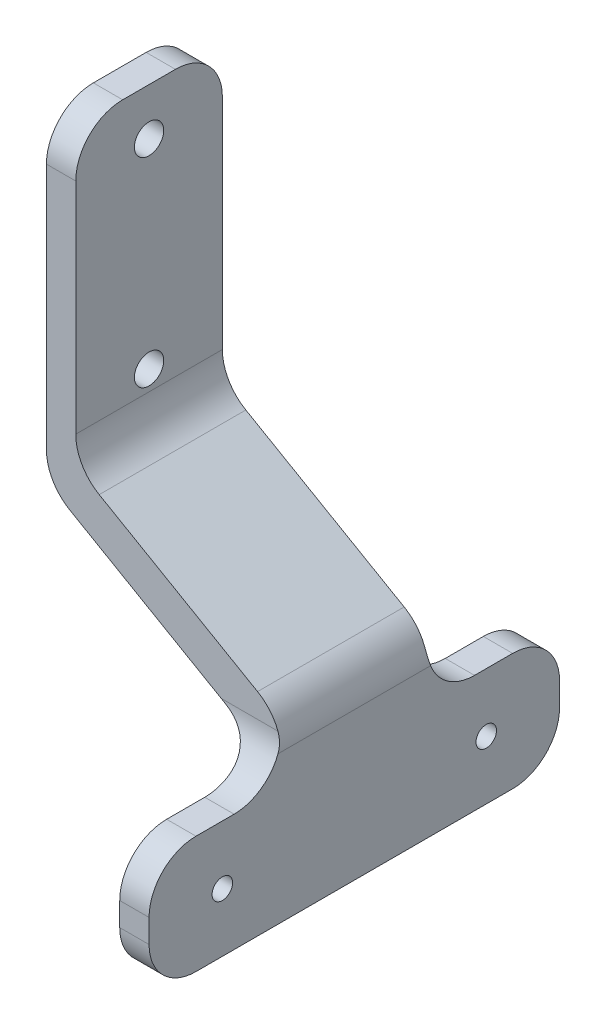
ISO-10303-21;
HEADER;
FILE_DESCRIPTION(('STEP AP214'),'2;1');
FILE_NAME('part.step','',(''),(''),'','','');
FILE_SCHEMA(('AUTOMOTIVE_DESIGN { 1 0 10303 214 1 1 1 1 }'));
ENDSEC;
DATA;
#1=APPLICATION_CONTEXT('core data for automotive mechanical design processes');
#2=APPLICATION_PROTOCOL_DEFINITION('international standard','automotive_design',2000,#1);
#3=PRODUCT_CONTEXT('',#1,'mechanical');
#4=PRODUCT('Part','Part','',(#3));
#5=PRODUCT_RELATED_PRODUCT_CATEGORY('part','',(#4));
#6=PRODUCT_DEFINITION_FORMATION('','',#4);
#7=PRODUCT_DEFINITION_CONTEXT('part definition',#1,'design');
#8=PRODUCT_DEFINITION('design','',#6,#7);
#9=PRODUCT_DEFINITION_SHAPE('','',#8);
#10=(LENGTH_UNIT() NAMED_UNIT(*) SI_UNIT(.MILLI.,.METRE.));
#11=(NAMED_UNIT(*) PLANE_ANGLE_UNIT() SI_UNIT($,.RADIAN.));
#12=(NAMED_UNIT(*) SI_UNIT($,.STERADIAN.) SOLID_ANGLE_UNIT());
#13=UNCERTAINTY_MEASURE_WITH_UNIT(LENGTH_MEASURE(1.E-05),#10,'distance_accuracy_value','');
#14=(GEOMETRIC_REPRESENTATION_CONTEXT(3) GLOBAL_UNCERTAINTY_ASSIGNED_CONTEXT((#13)) GLOBAL_UNIT_ASSIGNED_CONTEXT((#10,
#11,#12)) REPRESENTATION_CONTEXT('',''));
#15=CARTESIAN_POINT('',(0.,0.,0.));
#16=DIRECTION('',(0.,0.,1.));
#17=DIRECTION('',(1.,0.,0.));
#18=AXIS2_PLACEMENT_3D('',#15,#16,#17);
#19=CARTESIAN_POINT('',(0.,0.,12.5));
#20=DIRECTION('',(0.,0.,-1.));
#21=DIRECTION('',(-1.,0.,0.));
#22=AXIS2_PLACEMENT_3D('',#19,#20,#21);
#23=PLANE('',#22);
#24=DIRECTION('',(0.866025403784438,-0.500000000000001,0.));
#25=VECTOR('',#24,1.);
#26=CARTESIAN_POINT('',(-5.,20.2072594216369,12.5));
#27=LINE('',#26,#25);
#28=CARTESIAN_POINT('',(-1.,17.8978583448784,12.5));
#29=VERTEX_POINT('',#28);
#30=CARTESIAN_POINT('',(24.8038475772934,3.,12.5));
#31=VERTEX_POINT('',#30);
#32=EDGE_CURVE('E243',#29,#31,#27,.T.);
#33=ORIENTED_EDGE('',*,*,#32,.T.);
#34=DIRECTION('',(-1.,0.,0.));
#35=VECTOR('',#34,1.);
#36=CARTESIAN_POINT('',(0.,3.,12.5));
#37=LINE('',#36,#35);
#38=CARTESIAN_POINT('',(34.4842084400048,3.,12.5));
#39=VERTEX_POINT('',#38);
#40=EDGE_CURVE('E334',#31,#39,#37,.F.);
#41=ORIENTED_EDGE('',*,*,#40,.T.);
#42=CARTESIAN_POINT('',(27.,0.173938424846074,12.5));
#43=DIRECTION('',(0.,0.,-1.));
#44=DIRECTION('',(-1.,0.,0.));
#45=AXIS2_PLACEMENT_3D('',#42,#43,#44);
#46=CIRCLE('',#45,8.);
#47=CARTESIAN_POINT('',(31.,7.10214165512158,12.5));
#48=VERTEX_POINT('',#47);
#49=EDGE_CURVE('E289',#39,#48,#46,.F.);
#50=ORIENTED_EDGE('',*,*,#49,.T.);
#51=DIRECTION('',(-0.866025403784438,0.500000000000001,0.));
#52=VECTOR('',#51,1.);
#53=CARTESIAN_POINT('',(35.,4.79274057836308,12.5));
#54=LINE('',#53,#52);
#55=CARTESIAN_POINT('',(3.99999999999999,22.6905989232415,12.5));
#56=VERTEX_POINT('',#55);
#57=EDGE_CURVE('E240',#48,#56,#54,.T.);
#58=ORIENTED_EDGE('',*,*,#57,.T.);
#59=CARTESIAN_POINT('',(8.,29.618802153517,12.5));
#60=DIRECTION('',(0.,0.,-1.));
#61=DIRECTION('',(-1.,0.,0.));
#62=AXIS2_PLACEMENT_3D('',#59,#60,#61);
#63=CIRCLE('',#62,8.);
#64=CARTESIAN_POINT('',(0.,29.618802153517,12.5));
#65=VERTEX_POINT('',#64);
#66=EDGE_CURVE('E324',#56,#65,#63,.T.);
#67=ORIENTED_EDGE('',*,*,#66,.T.);
#68=DIRECTION('',(0.,1.,0.));
#69=VECTOR('',#68,1.);
#70=CARTESIAN_POINT('',(0.,0.,12.5));
#71=LINE('',#70,#69);
#72=CARTESIAN_POINT('',(0.,67.,12.5));
#73=VERTEX_POINT('',#72);
#74=EDGE_CURVE('E429',#65,#73,#71,.T.);
#75=ORIENTED_EDGE('',*,*,#74,.T.);
#76=DIRECTION('',(1.,0.,0.));
#77=VECTOR('',#76,1.);
#78=CARTESIAN_POINT('',(-5.,67.,12.5));
#79=LINE('',#78,#77);
#80=CARTESIAN_POINT('',(-5.,67.,12.5));
#81=VERTEX_POINT('',#80);
#82=EDGE_CURVE('E285',#73,#81,#79,.F.);
#83=ORIENTED_EDGE('',*,*,#82,.T.);
#84=DIRECTION('',(0.,1.,0.));
#85=VECTOR('',#84,1.);
#86=CARTESIAN_POINT('',(-5.,0.,12.5));
#87=LINE('',#86,#85);
#88=CARTESIAN_POINT('',(-5.,24.8260615751539,12.5));
#89=VERTEX_POINT('',#88);
#90=EDGE_CURVE('E407',#89,#81,#87,.T.);
#91=ORIENTED_EDGE('',*,*,#90,.F.);
#92=CARTESIAN_POINT('',(3.,24.8260615751539,12.5));
#93=DIRECTION('',(0.,0.,-1.));
#94=DIRECTION('',(-1.,0.,0.));
#95=AXIS2_PLACEMENT_3D('',#92,#93,#94);
#96=CIRCLE('',#95,8.);
#97=EDGE_CURVE('E287',#89,#29,#96,.F.);
#98=ORIENTED_EDGE('',*,*,#97,.T.);
#99=EDGE_LOOP('',(#33,#41,#50,#58,#67,#75,#83,#91,#98));
#100=FACE_BOUND('',#99,.T.);
#101=ADVANCED_FACE('F42',(#100),#23,.F.);
#102=CARTESIAN_POINT('',(0.,0.,-12.5));
#103=DIRECTION('',(0.,0.,-1.));
#104=DIRECTION('',(-1.,0.,0.));
#105=AXIS2_PLACEMENT_3D('',#102,#103,#104);
#106=PLANE('',#105);
#107=CARTESIAN_POINT('',(27.,0.173938424846074,-12.5));
#108=DIRECTION('',(0.,0.,-1.));
#109=DIRECTION('',(-1.,0.,0.));
#110=AXIS2_PLACEMENT_3D('',#107,#108,#109);
#111=CIRCLE('',#110,8.);
#112=CARTESIAN_POINT('',(31.,7.10214165512158,-12.5));
#113=VERTEX_POINT('',#112);
#114=CARTESIAN_POINT('',(34.4842084400048,3.,-12.5));
#115=VERTEX_POINT('',#114);
#116=EDGE_CURVE('E300',#113,#115,#111,.T.);
#117=ORIENTED_EDGE('',*,*,#116,.T.);
#118=DIRECTION('',(-1.,0.,0.));
#119=VECTOR('',#118,1.);
#120=CARTESIAN_POINT('',(30.,3.,-12.5));
#121=LINE('',#120,#119);
#122=CARTESIAN_POINT('',(24.8038475772934,3.,-12.5));
#123=VERTEX_POINT('',#122);
#124=EDGE_CURVE('E326',#115,#123,#121,.T.);
#125=ORIENTED_EDGE('',*,*,#124,.T.);
#126=DIRECTION('',(-0.866025403784438,0.500000000000001,0.));
#127=VECTOR('',#126,1.);
#128=CARTESIAN_POINT('',(7.50000000000001,12.9903810567666,-12.5));
#129=LINE('',#128,#127);
#130=CARTESIAN_POINT('',(-1.,17.8978583448784,-12.5));
#131=VERTEX_POINT('',#130);
#132=EDGE_CURVE('E250',#123,#131,#129,.T.);
#133=ORIENTED_EDGE('',*,*,#132,.T.);
#134=CARTESIAN_POINT('',(3.,24.8260615751539,-12.5));
#135=DIRECTION('',(0.,0.,-1.));
#136=DIRECTION('',(-1.,0.,0.));
#137=AXIS2_PLACEMENT_3D('',#134,#135,#136);
#138=CIRCLE('',#137,8.);
#139=CARTESIAN_POINT('',(-5.,24.8260615751539,-12.5));
#140=VERTEX_POINT('',#139);
#141=EDGE_CURVE('E298',#131,#140,#138,.T.);
#142=ORIENTED_EDGE('',*,*,#141,.T.);
#143=DIRECTION('',(0.,1.,0.));
#144=VECTOR('',#143,1.);
#145=CARTESIAN_POINT('',(-5.,0.,-12.5));
#146=LINE('',#145,#144);
#147=CARTESIAN_POINT('',(-5.,67.,-12.5));
#148=VERTEX_POINT('',#147);
#149=EDGE_CURVE('E416',#140,#148,#146,.T.);
#150=ORIENTED_EDGE('',*,*,#149,.T.);
#151=DIRECTION('',(1.,0.,0.));
#152=VECTOR('',#151,1.);
#153=CARTESIAN_POINT('',(0.,67.,-12.5));
#154=LINE('',#153,#152);
#155=CARTESIAN_POINT('',(0.,67.,-12.5));
#156=VERTEX_POINT('',#155);
#157=EDGE_CURVE('E295',#148,#156,#154,.T.);
#158=ORIENTED_EDGE('',*,*,#157,.T.);
#159=DIRECTION('',(0.,1.,0.));
#160=VECTOR('',#159,1.);
#161=CARTESIAN_POINT('',(0.,0.,-12.5));
#162=LINE('',#161,#160);
#163=CARTESIAN_POINT('',(0.,29.618802153517,-12.5));
#164=VERTEX_POINT('',#163);
#165=EDGE_CURVE('E433',#164,#156,#162,.T.);
#166=ORIENTED_EDGE('',*,*,#165,.F.);
#167=CARTESIAN_POINT('',(8.,29.618802153517,-12.5));
#168=DIRECTION('',(0.,0.,-1.));
#169=DIRECTION('',(-1.,0.,0.));
#170=AXIS2_PLACEMENT_3D('',#167,#168,#169);
#171=CIRCLE('',#170,8.);
#172=CARTESIAN_POINT('',(3.99999999999999,22.6905989232415,-12.5));
#173=VERTEX_POINT('',#172);
#174=EDGE_CURVE('E322',#164,#173,#171,.F.);
#175=ORIENTED_EDGE('',*,*,#174,.T.);
#176=DIRECTION('',(0.866025403784438,-0.500000000000001,0.));
#177=VECTOR('',#176,1.);
#178=CARTESIAN_POINT('',(10.8253175473055,18.75,-12.5));
#179=LINE('',#178,#177);
#180=EDGE_CURVE('E247',#173,#113,#179,.T.);
#181=ORIENTED_EDGE('',*,*,#180,.T.);
#182=EDGE_LOOP('',(#117,#125,#133,#142,#150,#158,#166,#175,#181));
#183=FACE_BOUND('',#182,.T.);
#184=ADVANCED_FACE('F552',(#183),#106,.T.);
#185=CARTESIAN_POINT('',(30.,0.,0.));
#186=DIRECTION('',(1.,0.,0.));
#187=DIRECTION('',(0.,0.,-1.));
#188=AXIS2_PLACEMENT_3D('',#185,#186,#187);
#189=PLANE('',#188);
#190=CARTESIAN_POINT('',(30.,-15.,22.5));
#191=DIRECTION('',(1.,0.,0.));
#192=DIRECTION('',(0.,0.,-1.));
#193=AXIS2_PLACEMENT_3D('',#190,#191,#192);
#194=CIRCLE('',#193,1.75);
#195=CARTESIAN_POINT('',(30.,-15.,20.75));
#196=VERTEX_POINT('',#195);
#197=EDGE_CURVE('E430',#196,#196,#194,.T.);
#198=ORIENTED_EDGE('',*,*,#197,.T.);
#199=EDGE_LOOP('',(#198));
#200=FACE_BOUND('',#199,.T.);
#201=CARTESIAN_POINT('',(30.,-15.,-22.5));
#202=DIRECTION('',(1.,0.,0.));
#203=DIRECTION('',(0.,0.,-1.));
#204=AXIS2_PLACEMENT_3D('',#201,#202,#203);
#205=CIRCLE('',#204,1.75);
#206=CARTESIAN_POINT('',(30.,-15.,-24.25));
#207=VERTEX_POINT('',#206);
#208=EDGE_CURVE('E504',#207,#207,#205,.T.);
#209=ORIENTED_EDGE('',*,*,#208,.T.);
#210=EDGE_LOOP('',(#209));
#211=FACE_BOUND('',#210,.T.);
#212=DIRECTION('',(0.,0.,-1.));
#213=VECTOR('',#212,1.);
#214=CARTESIAN_POINT('',(30.,-25.,0.));
#215=LINE('',#214,#213);
#216=CARTESIAN_POINT('',(30.,-25.,27.));
#217=VERTEX_POINT('',#216);
#218=CARTESIAN_POINT('',(30.,-25.,-27.));
#219=VERTEX_POINT('',#218);
#220=EDGE_CURVE('E220',#217,#219,#215,.T.);
#221=ORIENTED_EDGE('',*,*,#220,.F.);
#222=CARTESIAN_POINT('',(30.,-17.,27.));
#223=DIRECTION('',(1.,0.,0.));
#224=DIRECTION('',(0.,0.,-1.));
#225=AXIS2_PLACEMENT_3D('',#222,#223,#224);
#226=CIRCLE('',#225,8.);
#227=CARTESIAN_POINT('',(30.,-17.,35.));
#228=VERTEX_POINT('',#227);
#229=EDGE_CURVE('E203',#217,#228,#226,.F.);
#230=ORIENTED_EDGE('',*,*,#229,.T.);
#231=DIRECTION('',(0.,1.,0.));
#232=VECTOR('',#231,1.);
#233=CARTESIAN_POINT('',(30.,0.,35.));
#234=LINE('',#233,#232);
#235=CARTESIAN_POINT('',(30.,-13.,35.));
#236=VERTEX_POINT('',#235);
#237=EDGE_CURVE('E231',#228,#236,#234,.T.);
#238=ORIENTED_EDGE('',*,*,#237,.T.);
#239=CARTESIAN_POINT('',(30.,-13.,27.));
#240=DIRECTION('',(1.,0.,0.));
#241=DIRECTION('',(0.,0.,-1.));
#242=AXIS2_PLACEMENT_3D('',#239,#240,#241);
#243=CIRCLE('',#242,8.);
#244=CARTESIAN_POINT('',(30.,-5.,27.));
#245=VERTEX_POINT('',#244);
#246=EDGE_CURVE('E214',#236,#245,#243,.F.);
#247=ORIENTED_EDGE('',*,*,#246,.T.);
#248=DIRECTION('',(0.,0.,-1.));
#249=VECTOR('',#248,1.);
#250=CARTESIAN_POINT('',(30.,-5.,0.));
#251=LINE('',#250,#249);
#252=CARTESIAN_POINT('',(30.,-5.,20.5));
#253=VERTEX_POINT('',#252);
#254=EDGE_CURVE('E236',#245,#253,#251,.T.);
#255=ORIENTED_EDGE('',*,*,#254,.T.);
#256=CARTESIAN_POINT('',(30.,3.,20.5));
#257=DIRECTION('',(1.,0.,0.));
#258=DIRECTION('',(0.,0.,-1.));
#259=AXIS2_PLACEMENT_3D('',#256,#257,#258);
#260=CIRCLE('',#259,8.);
#261=CARTESIAN_POINT('',(30.,-4.61880215351701,18.0599480035098));
#262=VERTEX_POINT('',#261);
#263=EDGE_CURVE('E367',#253,#262,#260,.T.);
#264=ORIENTED_EDGE('',*,*,#263,.T.);
#265=DIRECTION('',(0.,0.,-1.));
#266=VECTOR('',#265,1.);
#267=CARTESIAN_POINT('',(30.,-4.61880215351701,0.));
#268=LINE('',#267,#266);
#269=CARTESIAN_POINT('',(30.,-4.61880215351701,-18.0599480035098));
#270=VERTEX_POINT('',#269);
#271=EDGE_CURVE('E224',#262,#270,#268,.T.);
#272=ORIENTED_EDGE('',*,*,#271,.T.);
#273=CARTESIAN_POINT('',(30.,3.,-20.5));
#274=DIRECTION('',(1.,0.,0.));
#275=DIRECTION('',(0.,0.,-1.));
#276=AXIS2_PLACEMENT_3D('',#273,#274,#275);
#277=CIRCLE('',#276,8.);
#278=CARTESIAN_POINT('',(30.,-5.,-20.5));
#279=VERTEX_POINT('',#278);
#280=EDGE_CURVE('E346',#270,#279,#277,.T.);
#281=ORIENTED_EDGE('',*,*,#280,.T.);
#282=CARTESIAN_POINT('',(30.,-5.,-27.));
#283=VERTEX_POINT('',#282);
#284=EDGE_CURVE('E234',#279,#283,#251,.T.);
#285=ORIENTED_EDGE('',*,*,#284,.T.);
#286=CARTESIAN_POINT('',(30.,-13.,-27.));
#287=DIRECTION('',(1.,0.,0.));
#288=DIRECTION('',(0.,0.,-1.));
#289=AXIS2_PLACEMENT_3D('',#286,#287,#288);
#290=CIRCLE('',#289,8.);
#291=CARTESIAN_POINT('',(30.,-13.,-35.));
#292=VERTEX_POINT('',#291);
#293=EDGE_CURVE('E254',#283,#292,#290,.F.);
#294=ORIENTED_EDGE('',*,*,#293,.T.);
#295=DIRECTION('',(0.,1.,0.));
#296=VECTOR('',#295,1.);
#297=CARTESIAN_POINT('',(30.,0.,-35.));
#298=LINE('',#297,#296);
#299=CARTESIAN_POINT('',(30.,-17.,-35.));
#300=VERTEX_POINT('',#299);
#301=EDGE_CURVE('E230',#300,#292,#298,.T.);
#302=ORIENTED_EDGE('',*,*,#301,.F.);
#303=CARTESIAN_POINT('',(30.,-17.,-27.));
#304=DIRECTION('',(1.,0.,0.));
#305=DIRECTION('',(0.,0.,-1.));
#306=AXIS2_PLACEMENT_3D('',#303,#304,#305);
#307=CIRCLE('',#306,8.);
#308=EDGE_CURVE('E229',#300,#219,#307,.F.);
#309=ORIENTED_EDGE('',*,*,#308,.T.);
#310=EDGE_LOOP('',(#221,#230,#238,#247,#255,#264,#272,#281,#285,#294,#302,#309));
#311=FACE_BOUND('',#310,.T.);
#312=ADVANCED_FACE('F227',(#200,#211,#311),#189,.F.);
#313=CARTESIAN_POINT('',(35.,-5.,0.));
#314=DIRECTION('',(0.,1.,0.));
#315=DIRECTION('',(0.,0.,1.));
#316=AXIS2_PLACEMENT_3D('',#313,#314,#315);
#317=PLANE('',#316);
#318=DIRECTION('',(0.,0.,-1.));
#319=VECTOR('',#318,1.);
#320=CARTESIAN_POINT('',(35.,-5.,0.));
#321=LINE('',#320,#319);
#322=CARTESIAN_POINT('',(35.,-5.,27.));
#323=VERTEX_POINT('',#322);
#324=CARTESIAN_POINT('',(35.,-5.,20.5));
#325=VERTEX_POINT('',#324);
#326=EDGE_CURVE('E436',#323,#325,#321,.T.);
#327=ORIENTED_EDGE('',*,*,#326,.T.);
#328=DIRECTION('',(-1.,0.,0.));
#329=VECTOR('',#328,1.);
#330=CARTESIAN_POINT('',(35.,-5.,20.5));
#331=LINE('',#330,#329);
#332=EDGE_CURVE('E331',#325,#253,#331,.T.);
#333=ORIENTED_EDGE('',*,*,#332,.T.);
#334=ORIENTED_EDGE('',*,*,#254,.F.);
#335=DIRECTION('',(-1.,0.,0.));
#336=VECTOR('',#335,1.);
#337=CARTESIAN_POINT('',(35.,-5.,27.));
#338=LINE('',#337,#336);
#339=EDGE_CURVE('E271',#245,#323,#338,.F.);
#340=ORIENTED_EDGE('',*,*,#339,.T.);
#341=EDGE_LOOP('',(#327,#333,#334,#340));
#342=FACE_BOUND('',#341,.T.);
#343=ADVANCED_FACE('F475',(#342),#317,.T.);
#344=CARTESIAN_POINT('',(35.,0.,35.));
#345=DIRECTION('',(0.,0.,1.));
#346=DIRECTION('',(0.,-1.,0.));
#347=AXIS2_PLACEMENT_3D('',#344,#345,#346);
#348=PLANE('',#347);
#349=ORIENTED_EDGE('',*,*,#237,.F.);
#350=DIRECTION('',(-1.,0.,0.));
#351=VECTOR('',#350,1.);
#352=CARTESIAN_POINT('',(35.,-17.,35.));
#353=LINE('',#352,#351);
#354=CARTESIAN_POINT('',(35.,-17.,35.));
#355=VERTEX_POINT('',#354);
#356=EDGE_CURVE('E208',#228,#355,#353,.F.);
#357=ORIENTED_EDGE('',*,*,#356,.T.);
#358=DIRECTION('',(0.,1.,0.));
#359=VECTOR('',#358,1.);
#360=CARTESIAN_POINT('',(35.,0.,35.));
#361=LINE('',#360,#359);
#362=CARTESIAN_POINT('',(35.,-13.,35.));
#363=VERTEX_POINT('',#362);
#364=EDGE_CURVE('E439',#355,#363,#361,.T.);
#365=ORIENTED_EDGE('',*,*,#364,.T.);
#366=DIRECTION('',(-1.,0.,0.));
#367=VECTOR('',#366,1.);
#368=CARTESIAN_POINT('',(35.,-13.,35.));
#369=LINE('',#368,#367);
#370=EDGE_CURVE('E213',#363,#236,#369,.T.);
#371=ORIENTED_EDGE('',*,*,#370,.T.);
#372=EDGE_LOOP('',(#349,#357,#365,#371));
#373=FACE_BOUND('',#372,.T.);
#374=ADVANCED_FACE('F470',(#373),#348,.T.);
#375=CARTESIAN_POINT('',(35.,-25.,0.));
#376=DIRECTION('',(0.,1.,0.));
#377=DIRECTION('',(0.,0.,1.));
#378=AXIS2_PLACEMENT_3D('',#375,#376,#377);
#379=PLANE('',#378);
#380=DIRECTION('',(0.,0.,-1.));
#381=VECTOR('',#380,1.);
#382=CARTESIAN_POINT('',(35.,-25.,0.));
#383=LINE('',#382,#381);
#384=CARTESIAN_POINT('',(35.,-25.,27.));
#385=VERTEX_POINT('',#384);
#386=CARTESIAN_POINT('',(35.,-25.,-27.));
#387=VERTEX_POINT('',#386);
#388=EDGE_CURVE('E223',#385,#387,#383,.T.);
#389=ORIENTED_EDGE('',*,*,#388,.F.);
#390=DIRECTION('',(-1.,0.,0.));
#391=VECTOR('',#390,1.);
#392=CARTESIAN_POINT('',(30.,-25.,27.));
#393=LINE('',#392,#391);
#394=EDGE_CURVE('E207',#385,#217,#393,.T.);
#395=ORIENTED_EDGE('',*,*,#394,.T.);
#396=ORIENTED_EDGE('',*,*,#220,.T.);
#397=DIRECTION('',(-1.,0.,0.));
#398=VECTOR('',#397,1.);
#399=CARTESIAN_POINT('',(35.,-25.,-27.));
#400=LINE('',#399,#398);
#401=EDGE_CURVE('E225',#219,#387,#400,.F.);
#402=ORIENTED_EDGE('',*,*,#401,.T.);
#403=EDGE_LOOP('',(#389,#395,#396,#402));
#404=FACE_BOUND('',#403,.T.);
#405=ADVANCED_FACE('F219',(#404),#379,.F.);
#406=CARTESIAN_POINT('',(35.,0.,-35.));
#407=DIRECTION('',(0.,0.,1.));
#408=DIRECTION('',(1.,0.,0.));
#409=AXIS2_PLACEMENT_3D('',#406,#407,#408);
#410=PLANE('',#409);
#411=DIRECTION('',(0.,1.,0.));
#412=VECTOR('',#411,1.);
#413=CARTESIAN_POINT('',(35.,0.,-35.));
#414=LINE('',#413,#412);
#415=CARTESIAN_POINT('',(35.,-17.,-35.));
#416=VERTEX_POINT('',#415);
#417=CARTESIAN_POINT('',(35.,-13.,-35.));
#418=VERTEX_POINT('',#417);
#419=EDGE_CURVE('E443',#416,#418,#414,.T.);
#420=ORIENTED_EDGE('',*,*,#419,.F.);
#421=DIRECTION('',(-1.,0.,0.));
#422=VECTOR('',#421,1.);
#423=CARTESIAN_POINT('',(35.,-17.,-35.));
#424=LINE('',#423,#422);
#425=EDGE_CURVE('E275',#416,#300,#424,.T.);
#426=ORIENTED_EDGE('',*,*,#425,.T.);
#427=ORIENTED_EDGE('',*,*,#301,.T.);
#428=DIRECTION('',(-1.,0.,0.));
#429=VECTOR('',#428,1.);
#430=CARTESIAN_POINT('',(35.,-13.,-35.));
#431=LINE('',#430,#429);
#432=EDGE_CURVE('E273',#292,#418,#431,.F.);
#433=ORIENTED_EDGE('',*,*,#432,.T.);
#434=EDGE_LOOP('',(#420,#426,#427,#433));
#435=FACE_BOUND('',#434,.T.);
#436=ADVANCED_FACE('F461',(#435),#410,.F.);
#437=ORIENTED_EDGE('',*,*,#284,.F.);
#438=DIRECTION('',(-1.,0.,0.));
#439=VECTOR('',#438,1.);
#440=CARTESIAN_POINT('',(35.,-5.,-20.5));
#441=LINE('',#440,#439);
#442=CARTESIAN_POINT('',(35.,-5.,-20.5));
#443=VERTEX_POINT('',#442);
#444=EDGE_CURVE('E329',#279,#443,#441,.F.);
#445=ORIENTED_EDGE('',*,*,#444,.T.);
#446=CARTESIAN_POINT('',(35.,-5.,-27.));
#447=VERTEX_POINT('',#446);
#448=EDGE_CURVE('E244',#443,#447,#321,.T.);
#449=ORIENTED_EDGE('',*,*,#448,.T.);
#450=DIRECTION('',(-1.,0.,0.));
#451=VECTOR('',#450,1.);
#452=CARTESIAN_POINT('',(30.,-5.,-27.));
#453=LINE('',#452,#451);
#454=EDGE_CURVE('E278',#447,#283,#453,.T.);
#455=ORIENTED_EDGE('',*,*,#454,.T.);
#456=EDGE_LOOP('',(#437,#445,#449,#455));
#457=FACE_BOUND('',#456,.T.);
#458=ADVANCED_FACE('F450',(#457),#317,.T.);
#459=CARTESIAN_POINT('',(35.,0.,0.));
#460=DIRECTION('',(1.,0.,0.));
#461=DIRECTION('',(0.,0.,-1.));
#462=AXIS2_PLACEMENT_3D('',#459,#460,#461);
#463=PLANE('',#462);
#464=CARTESIAN_POINT('',(35.,-15.,22.5));
#465=DIRECTION('',(1.,0.,0.));
#466=DIRECTION('',(0.,0.,-1.));
#467=AXIS2_PLACEMENT_3D('',#464,#465,#466);
#468=CIRCLE('',#467,1.75);
#469=CARTESIAN_POINT('',(35.,-15.,20.75));
#470=VERTEX_POINT('',#469);
#471=EDGE_CURVE('E507',#470,#470,#468,.T.);
#472=ORIENTED_EDGE('',*,*,#471,.F.);
#473=EDGE_LOOP('',(#472));
#474=FACE_BOUND('',#473,.T.);
#475=CARTESIAN_POINT('',(35.,-15.,-22.5));
#476=DIRECTION('',(1.,0.,0.));
#477=DIRECTION('',(0.,0.,-1.));
#478=AXIS2_PLACEMENT_3D('',#475,#476,#477);
#479=CIRCLE('',#478,1.75);
#480=CARTESIAN_POINT('',(35.,-15.,-24.25));
#481=VERTEX_POINT('',#480);
#482=EDGE_CURVE('E508',#481,#481,#479,.T.);
#483=ORIENTED_EDGE('',*,*,#482,.F.);
#484=EDGE_LOOP('',(#483));
#485=FACE_BOUND('',#484,.T.);
#486=ORIENTED_EDGE('',*,*,#364,.F.);
#487=CARTESIAN_POINT('',(35.,-17.,27.));
#488=DIRECTION('',(1.,0.,0.));
#489=DIRECTION('',(0.,0.,-1.));
#490=AXIS2_PLACEMENT_3D('',#487,#488,#489);
#491=CIRCLE('',#490,8.);
#492=EDGE_CURVE('E269',#355,#385,#491,.T.);
#493=ORIENTED_EDGE('',*,*,#492,.T.);
#494=ORIENTED_EDGE('',*,*,#388,.T.);
#495=CARTESIAN_POINT('',(35.,-17.,-27.));
#496=DIRECTION('',(1.,0.,0.));
#497=DIRECTION('',(0.,0.,-1.));
#498=AXIS2_PLACEMENT_3D('',#495,#496,#497);
#499=CIRCLE('',#498,8.);
#500=EDGE_CURVE('E265',#387,#416,#499,.T.);
#501=ORIENTED_EDGE('',*,*,#500,.T.);
#502=ORIENTED_EDGE('',*,*,#419,.T.);
#503=CARTESIAN_POINT('',(35.,-13.,-27.));
#504=DIRECTION('',(1.,0.,0.));
#505=DIRECTION('',(0.,0.,-1.));
#506=AXIS2_PLACEMENT_3D('',#503,#504,#505);
#507=CIRCLE('',#506,8.);
#508=EDGE_CURVE('E262',#418,#447,#507,.T.);
#509=ORIENTED_EDGE('',*,*,#508,.T.);
#510=ORIENTED_EDGE('',*,*,#448,.F.);
#511=CARTESIAN_POINT('',(35.,3.,-20.5));
#512=DIRECTION('',(1.,0.,0.));
#513=DIRECTION('',(0.,0.,-1.));
#514=AXIS2_PLACEMENT_3D('',#511,#512,#513);
#515=CIRCLE('',#514,8.);
#516=CARTESIAN_POINT('',(35.,0.173938424846074,-13.0157915599952));
#517=VERTEX_POINT('',#516);
#518=EDGE_CURVE('E368',#443,#517,#515,.F.);
#519=ORIENTED_EDGE('',*,*,#518,.T.);
#520=DIRECTION('',(0.,0.,1.));
#521=VECTOR('',#520,1.);
#522=CARTESIAN_POINT('',(35.,0.173938424846074,0.));
#523=LINE('',#522,#521);
#524=CARTESIAN_POINT('',(35.,0.173938424846074,13.0157915599952));
#525=VERTEX_POINT('',#524);
#526=EDGE_CURVE('E57',#517,#525,#523,.T.);
#527=ORIENTED_EDGE('',*,*,#526,.T.);
#528=CARTESIAN_POINT('',(35.,3.,20.5));
#529=DIRECTION('',(1.,0.,0.));
#530=DIRECTION('',(0.,0.,-1.));
#531=AXIS2_PLACEMENT_3D('',#528,#529,#530);
#532=CIRCLE('',#531,8.);
#533=EDGE_CURVE('E11',#525,#325,#532,.F.);
#534=ORIENTED_EDGE('',*,*,#533,.T.);
#535=ORIENTED_EDGE('',*,*,#326,.F.);
#536=CARTESIAN_POINT('',(35.,-13.,27.));
#537=DIRECTION('',(1.,0.,0.));
#538=DIRECTION('',(0.,0.,-1.));
#539=AXIS2_PLACEMENT_3D('',#536,#537,#538);
#540=CIRCLE('',#539,8.);
#541=EDGE_CURVE('E267',#323,#363,#540,.T.);
#542=ORIENTED_EDGE('',*,*,#541,.T.);
#543=EDGE_LOOP('',(#486,#493,#494,#501,#502,#509,#510,#519,#527,#534,#535,#542));
#544=FACE_BOUND('',#543,.T.);
#545=ADVANCED_FACE('F455',(#474,#485,#544),#463,.T.);
#546=CARTESIAN_POINT('',(0.,0.,0.));
#547=DIRECTION('',(-1.,0.,0.));
#548=DIRECTION('',(0.,0.,1.));
#549=AXIS2_PLACEMENT_3D('',#546,#547,#548);
#550=PLANE('',#549);
#551=CARTESIAN_POINT('',(0.,67.,0.));
#552=DIRECTION('',(1.,0.,0.));
#553=DIRECTION('',(0.,0.,-1.));
#554=AXIS2_PLACEMENT_3D('',#551,#552,#553);
#555=CIRCLE('',#554,2.5);
#556=CARTESIAN_POINT('',(0.,67.,-2.5));
#557=VERTEX_POINT('',#556);
#558=EDGE_CURVE('E520',#557,#557,#555,.T.);
#559=ORIENTED_EDGE('',*,*,#558,.F.);
#560=EDGE_LOOP('',(#559));
#561=FACE_BOUND('',#560,.T.);
#562=CARTESIAN_POINT('',(0.,33.,0.));
#563=DIRECTION('',(1.,0.,0.));
#564=DIRECTION('',(0.,0.,-1.));
#565=AXIS2_PLACEMENT_3D('',#562,#563,#564);
#566=CIRCLE('',#565,2.5);
#567=CARTESIAN_POINT('',(0.,33.,-2.5));
#568=VERTEX_POINT('',#567);
#569=EDGE_CURVE('E514',#568,#568,#566,.T.);
#570=ORIENTED_EDGE('',*,*,#569,.F.);
#571=EDGE_LOOP('',(#570));
#572=FACE_BOUND('',#571,.T.);
#573=ORIENTED_EDGE('',*,*,#74,.F.);
#574=DIRECTION('',(0.,0.,-1.));
#575=VECTOR('',#574,1.);
#576=CARTESIAN_POINT('',(0.,29.618802153517,0.));
#577=LINE('',#576,#575);
#578=EDGE_CURVE('E314',#65,#164,#577,.T.);
#579=ORIENTED_EDGE('',*,*,#578,.T.);
#580=ORIENTED_EDGE('',*,*,#165,.T.);
#581=CARTESIAN_POINT('',(0.,67.,-4.5));
#582=DIRECTION('',(-1.,0.,0.));
#583=DIRECTION('',(0.,0.,1.));
#584=AXIS2_PLACEMENT_3D('',#581,#582,#583);
#585=CIRCLE('',#584,8.);
#586=CARTESIAN_POINT('',(0.,75.,-4.5));
#587=VERTEX_POINT('',#586);
#588=EDGE_CURVE('E310',#156,#587,#585,.F.);
#589=ORIENTED_EDGE('',*,*,#588,.T.);
#590=DIRECTION('',(0.,0.,1.));
#591=VECTOR('',#590,1.);
#592=CARTESIAN_POINT('',(0.,75.,-12.5));
#593=LINE('',#592,#591);
#594=CARTESIAN_POINT('',(0.,75.,4.5));
#595=VERTEX_POINT('',#594);
#596=EDGE_CURVE('E426',#587,#595,#593,.T.);
#597=ORIENTED_EDGE('',*,*,#596,.T.);
#598=CARTESIAN_POINT('',(0.,67.,4.5));
#599=DIRECTION('',(-1.,0.,0.));
#600=DIRECTION('',(0.,0.,1.));
#601=AXIS2_PLACEMENT_3D('',#598,#599,#600);
#602=CIRCLE('',#601,8.);
#603=EDGE_CURVE('E312',#595,#73,#602,.F.);
#604=ORIENTED_EDGE('',*,*,#603,.T.);
#605=EDGE_LOOP('',(#573,#579,#580,#589,#597,#604));
#606=FACE_BOUND('',#605,.T.);
#607=ADVANCED_FACE('F491',(#561,#572,#606),#550,.F.);
#608=CARTESIAN_POINT('',(-5.,75.,-12.5));
#609=DIRECTION('',(0.,1.,0.));
#610=DIRECTION('',(0.,0.,1.));
#611=AXIS2_PLACEMENT_3D('',#608,#609,#610);
#612=PLANE('',#611);
#613=DIRECTION('',(0.,0.,1.));
#614=VECTOR('',#613,1.);
#615=CARTESIAN_POINT('',(-5.,75.,-12.5));
#616=LINE('',#615,#614);
#617=CARTESIAN_POINT('',(-5.,75.,-4.5));
#618=VERTEX_POINT('',#617);
#619=CARTESIAN_POINT('',(-5.,75.,4.5));
#620=VERTEX_POINT('',#619);
#621=EDGE_CURVE('E422',#618,#620,#616,.T.);
#622=ORIENTED_EDGE('',*,*,#621,.T.);
#623=DIRECTION('',(1.,0.,0.));
#624=VECTOR('',#623,1.);
#625=CARTESIAN_POINT('',(0.,75.,4.5));
#626=LINE('',#625,#624);
#627=EDGE_CURVE('E319',#620,#595,#626,.T.);
#628=ORIENTED_EDGE('',*,*,#627,.T.);
#629=ORIENTED_EDGE('',*,*,#596,.F.);
#630=DIRECTION('',(1.,0.,0.));
#631=VECTOR('',#630,1.);
#632=CARTESIAN_POINT('',(-5.,75.,-4.5));
#633=LINE('',#632,#631);
#634=EDGE_CURVE('E317',#587,#618,#633,.F.);
#635=ORIENTED_EDGE('',*,*,#634,.T.);
#636=EDGE_LOOP('',(#622,#628,#629,#635));
#637=FACE_BOUND('',#636,.T.);
#638=ADVANCED_FACE('F499',(#637),#612,.T.);
#639=CARTESIAN_POINT('',(-5.,0.,0.));
#640=DIRECTION('',(-1.,0.,0.));
#641=DIRECTION('',(0.,0.,1.));
#642=AXIS2_PLACEMENT_3D('',#639,#640,#641);
#643=PLANE('',#642);
#644=CARTESIAN_POINT('',(-5.,67.,0.));
#645=DIRECTION('',(1.,0.,0.));
#646=DIRECTION('',(0.,0.,-1.));
#647=AXIS2_PLACEMENT_3D('',#644,#645,#646);
#648=CIRCLE('',#647,2.5);
#649=CARTESIAN_POINT('',(-5.,67.,-2.5));
#650=VERTEX_POINT('',#649);
#651=EDGE_CURVE('E511',#650,#650,#648,.T.);
#652=ORIENTED_EDGE('',*,*,#651,.T.);
#653=EDGE_LOOP('',(#652));
#654=FACE_BOUND('',#653,.T.);
#655=CARTESIAN_POINT('',(-5.,33.,0.));
#656=DIRECTION('',(1.,0.,0.));
#657=DIRECTION('',(0.,0.,-1.));
#658=AXIS2_PLACEMENT_3D('',#655,#656,#657);
#659=CIRCLE('',#658,2.5);
#660=CARTESIAN_POINT('',(-5.,33.,-2.5));
#661=VERTEX_POINT('',#660);
#662=EDGE_CURVE('E517',#661,#661,#659,.T.);
#663=ORIENTED_EDGE('',*,*,#662,.T.);
#664=EDGE_LOOP('',(#663));
#665=FACE_BOUND('',#664,.T.);
#666=ORIENTED_EDGE('',*,*,#149,.F.);
#667=DIRECTION('',(0.,0.,1.));
#668=VECTOR('',#667,1.);
#669=CARTESIAN_POINT('',(-5.,24.8260615751539,0.));
#670=LINE('',#669,#668);
#671=EDGE_CURVE('E307',#140,#89,#670,.T.);
#672=ORIENTED_EDGE('',*,*,#671,.T.);
#673=ORIENTED_EDGE('',*,*,#90,.T.);
#674=CARTESIAN_POINT('',(-5.,67.,4.5));
#675=DIRECTION('',(-1.,0.,0.));
#676=DIRECTION('',(0.,0.,1.));
#677=AXIS2_PLACEMENT_3D('',#674,#675,#676);
#678=CIRCLE('',#677,8.);
#679=EDGE_CURVE('E305',#81,#620,#678,.T.);
#680=ORIENTED_EDGE('',*,*,#679,.T.);
#681=ORIENTED_EDGE('',*,*,#621,.F.);
#682=CARTESIAN_POINT('',(-5.,67.,-4.5));
#683=DIRECTION('',(-1.,0.,0.));
#684=DIRECTION('',(0.,0.,1.));
#685=AXIS2_PLACEMENT_3D('',#682,#683,#684);
#686=CIRCLE('',#685,8.);
#687=EDGE_CURVE('E303',#618,#148,#686,.T.);
#688=ORIENTED_EDGE('',*,*,#687,.T.);
#689=EDGE_LOOP('',(#666,#672,#673,#680,#681,#688));
#690=FACE_BOUND('',#689,.T.);
#691=ADVANCED_FACE('F413',(#654,#665,#690),#643,.T.);
#692=CARTESIAN_POINT('',(-5.,-15.,-22.5));
#693=DIRECTION('',(1.,0.,0.));
#694=DIRECTION('',(0.,0.,-1.));
#695=AXIS2_PLACEMENT_3D('',#692,#693,#694);
#696=CYLINDRICAL_SURFACE('',#695,1.75);
#697=ORIENTED_EDGE('',*,*,#482,.T.);
#698=EDGE_LOOP('',(#697));
#699=FACE_BOUND('',#698,.T.);
#700=ORIENTED_EDGE('',*,*,#208,.F.);
#701=EDGE_LOOP('',(#700));
#702=FACE_BOUND('',#701,.T.);
#703=ADVANCED_FACE('F547',(#699,#702),#696,.F.);
#704=CARTESIAN_POINT('',(-5.,-15.,22.5));
#705=DIRECTION('',(1.,0.,0.));
#706=DIRECTION('',(0.,0.,-1.));
#707=AXIS2_PLACEMENT_3D('',#704,#705,#706);
#708=CYLINDRICAL_SURFACE('',#707,1.75);
#709=ORIENTED_EDGE('',*,*,#471,.T.);
#710=EDGE_LOOP('',(#709));
#711=FACE_BOUND('',#710,.T.);
#712=ORIENTED_EDGE('',*,*,#197,.F.);
#713=EDGE_LOOP('',(#712));
#714=FACE_BOUND('',#713,.T.);
#715=ADVANCED_FACE('F541',(#711,#714),#708,.F.);
#716=CARTESIAN_POINT('',(-5.,33.,0.));
#717=DIRECTION('',(1.,0.,0.));
#718=DIRECTION('',(0.,0.,-1.));
#719=AXIS2_PLACEMENT_3D('',#716,#717,#718);
#720=CYLINDRICAL_SURFACE('',#719,2.5);
#721=ORIENTED_EDGE('',*,*,#662,.F.);
#722=EDGE_LOOP('',(#721));
#723=FACE_BOUND('',#722,.T.);
#724=ORIENTED_EDGE('',*,*,#569,.T.);
#725=EDGE_LOOP('',(#724));
#726=FACE_BOUND('',#725,.T.);
#727=ADVANCED_FACE('F531',(#723,#726),#720,.F.);
#728=CARTESIAN_POINT('',(-5.,67.,0.));
#729=DIRECTION('',(1.,0.,0.));
#730=DIRECTION('',(0.,0.,-1.));
#731=AXIS2_PLACEMENT_3D('',#728,#729,#730);
#732=CYLINDRICAL_SURFACE('',#731,2.5);
#733=ORIENTED_EDGE('',*,*,#651,.F.);
#734=EDGE_LOOP('',(#733));
#735=FACE_BOUND('',#734,.T.);
#736=ORIENTED_EDGE('',*,*,#558,.T.);
#737=EDGE_LOOP('',(#736));
#738=FACE_BOUND('',#737,.T.);
#739=ADVANCED_FACE('F528',(#735,#738),#732,.F.);
#740=CARTESIAN_POINT('',(-5.,20.2072594216369,0.));
#741=DIRECTION('',(-0.5,-0.866025403784438,0.));
#742=DIRECTION('',(0.,0.,-1.));
#743=AXIS2_PLACEMENT_3D('',#740,#741,#742);
#744=PLANE('',#743);
#745=ORIENTED_EDGE('',*,*,#132,.F.);
#746=CARTESIAN_POINT('',(24.8038475772934,3.,-20.5));
#747=DIRECTION('',(-0.5,-0.866025403784438,0.));
#748=DIRECTION('',(0.866025403784438,-0.500000000000001,0.));
#749=AXIS2_PLACEMENT_3D('',#746,#747,#748);
#750=ELLIPSE('',#749,16.,8.);
#751=CARTESIAN_POINT('',(26.,2.3094010767585,-12.529863669471));
#752=VERTEX_POINT('',#751);
#753=EDGE_CURVE('E336',#123,#752,#750,.F.);
#754=ORIENTED_EDGE('',*,*,#753,.T.);
#755=DIRECTION('',(0.,0.,-1.));
#756=VECTOR('',#755,1.);
#757=CARTESIAN_POINT('',(26.,2.3094010767585,0.));
#758=LINE('',#757,#756);
#759=CARTESIAN_POINT('',(26.,2.3094010767585,12.529863669471));
#760=VERTEX_POINT('',#759);
#761=EDGE_CURVE('E65',#752,#760,#758,.F.);
#762=ORIENTED_EDGE('',*,*,#761,.T.);
#763=CARTESIAN_POINT('',(24.8038475772934,3.,20.5));
#764=DIRECTION('',(-0.5,-0.866025403784438,0.));
#765=DIRECTION('',(-0.866025403784438,0.500000000000001,0.));
#766=AXIS2_PLACEMENT_3D('',#763,#764,#765);
#767=ELLIPSE('',#766,16.,8.);
#768=EDGE_CURVE('E383',#760,#31,#767,.F.);
#769=ORIENTED_EDGE('',*,*,#768,.T.);
#770=ORIENTED_EDGE('',*,*,#32,.F.);
#771=DIRECTION('',(0.,0.,1.));
#772=VECTOR('',#771,1.);
#773=CARTESIAN_POINT('',(-1.,17.8978583448784,0.));
#774=LINE('',#773,#772);
#775=EDGE_CURVE('E281',#29,#131,#774,.F.);
#776=ORIENTED_EDGE('',*,*,#775,.T.);
#777=EDGE_LOOP('',(#745,#754,#762,#769,#770,#776));
#778=FACE_BOUND('',#777,.T.);
#779=ADVANCED_FACE('F401',(#778),#744,.T.);
#780=CARTESIAN_POINT('',(35.,4.79274057836308,0.));
#781=DIRECTION('',(0.5,0.866025403784438,0.));
#782=DIRECTION('',(0.,0.,-1.));
#783=AXIS2_PLACEMENT_3D('',#780,#781,#782);
#784=PLANE('',#783);
#785=ORIENTED_EDGE('',*,*,#57,.F.);
#786=DIRECTION('',(0.,0.,1.));
#787=VECTOR('',#786,1.);
#788=CARTESIAN_POINT('',(31.,7.10214165512158,0.));
#789=LINE('',#788,#787);
#790=EDGE_CURVE('E293',#48,#113,#789,.F.);
#791=ORIENTED_EDGE('',*,*,#790,.T.);
#792=ORIENTED_EDGE('',*,*,#180,.F.);
#793=DIRECTION('',(0.,0.,-1.));
#794=VECTOR('',#793,1.);
#795=CARTESIAN_POINT('',(4.,22.6905989232415,0.));
#796=LINE('',#795,#794);
#797=EDGE_CURVE('E291',#173,#56,#796,.F.);
#798=ORIENTED_EDGE('',*,*,#797,.T.);
#799=EDGE_LOOP('',(#785,#791,#792,#798));
#800=FACE_BOUND('',#799,.T.);
#801=ADVANCED_FACE('F482',(#800),#784,.T.);
#802=CARTESIAN_POINT('',(35.,-17.,27.));
#803=DIRECTION('',(1.,0.,0.));
#804=DIRECTION('',(0.,0.,-1.));
#805=AXIS2_PLACEMENT_3D('',#802,#803,#804);
#806=CYLINDRICAL_SURFACE('',#805,8.);
#807=ORIENTED_EDGE('',*,*,#492,.F.);
#808=ORIENTED_EDGE('',*,*,#356,.F.);
#809=ORIENTED_EDGE('',*,*,#229,.F.);
#810=ORIENTED_EDGE('',*,*,#394,.F.);
#811=EDGE_LOOP('',(#807,#808,#809,#810));
#812=FACE_BOUND('',#811,.T.);
#813=ADVANCED_FACE('F206',(#812),#806,.T.);
#814=CARTESIAN_POINT('',(35.,-13.,27.));
#815=DIRECTION('',(-1.,0.,0.));
#816=DIRECTION('',(0.,0.,1.));
#817=AXIS2_PLACEMENT_3D('',#814,#815,#816);
#818=CYLINDRICAL_SURFACE('',#817,8.);
#819=ORIENTED_EDGE('',*,*,#541,.F.);
#820=ORIENTED_EDGE('',*,*,#339,.F.);
#821=ORIENTED_EDGE('',*,*,#246,.F.);
#822=ORIENTED_EDGE('',*,*,#370,.F.);
#823=EDGE_LOOP('',(#819,#820,#821,#822));
#824=FACE_BOUND('',#823,.T.);
#825=ADVANCED_FACE('F472',(#824),#818,.T.);
#826=CARTESIAN_POINT('',(35.,-17.,-27.));
#827=DIRECTION('',(-1.,0.,0.));
#828=DIRECTION('',(0.,0.,1.));
#829=AXIS2_PLACEMENT_3D('',#826,#827,#828);
#830=CYLINDRICAL_SURFACE('',#829,8.);
#831=ORIENTED_EDGE('',*,*,#500,.F.);
#832=ORIENTED_EDGE('',*,*,#401,.F.);
#833=ORIENTED_EDGE('',*,*,#308,.F.);
#834=ORIENTED_EDGE('',*,*,#425,.F.);
#835=EDGE_LOOP('',(#831,#832,#833,#834));
#836=FACE_BOUND('',#835,.T.);
#837=ADVANCED_FACE('F465',(#836),#830,.T.);
#838=CARTESIAN_POINT('',(35.,-13.,-27.));
#839=DIRECTION('',(1.,0.,0.));
#840=DIRECTION('',(0.,0.,-1.));
#841=AXIS2_PLACEMENT_3D('',#838,#839,#840);
#842=CYLINDRICAL_SURFACE('',#841,8.);
#843=ORIENTED_EDGE('',*,*,#508,.F.);
#844=ORIENTED_EDGE('',*,*,#432,.F.);
#845=ORIENTED_EDGE('',*,*,#293,.F.);
#846=ORIENTED_EDGE('',*,*,#454,.F.);
#847=EDGE_LOOP('',(#843,#844,#845,#846));
#848=FACE_BOUND('',#847,.T.);
#849=ADVANCED_FACE('F459',(#848),#842,.T.);
#850=CARTESIAN_POINT('',(22.,-4.61880215351701,0.));
#851=DIRECTION('',(0.,0.,-1.));
#852=DIRECTION('',(-1.,0.,0.));
#853=AXIS2_PLACEMENT_3D('',#850,#851,#852);
#854=CYLINDRICAL_SURFACE('',#853,8.);
#855=ORIENTED_EDGE('',*,*,#271,.F.);
#856=CARTESIAN_POINT('',(30.,-4.61880215351701,18.0599480035098));
#857=CARTESIAN_POINT('',(29.9999625822067,-4.55505234623239,17.8608257762648));
#858=CARTESIAN_POINT('',(29.9992371037628,-4.48345213431699,17.6642022467111));
#859=CARTESIAN_POINT('',(29.995008432371,-4.32507193893851,17.2771168150537));
#860=CARTESIAN_POINT('',(29.9915042258911,-4.23828642568925,17.0866571876009));
#861=CARTESIAN_POINT('',(29.9802836314763,-4.04958508472434,16.7121811531371));
#862=CARTESIAN_POINT('',(29.9725441201655,-3.94758845368447,16.5282060729016));
#863=CARTESIAN_POINT('',(29.9511835781977,-3.72960046050773,16.1691134317046));
#864=CARTESIAN_POINT('',(29.9375632201083,-3.61361069979867,15.9939948604192));
#865=CARTESIAN_POINT('',(29.9026089997219,-3.36812476933494,15.653222406418));
#866=CARTESIAN_POINT('',(29.8812447896145,-3.23857690675286,15.4876087727274));
#867=CARTESIAN_POINT('',(29.8289672613346,-2.96765191796473,15.1679251763844));
#868=CARTESIAN_POINT('',(29.7980535904446,-2.82627435495939,15.0138556403841));
#869=CARTESIAN_POINT('',(29.7249933350111,-2.53382889740539,14.719021632473));
#870=CARTESIAN_POINT('',(29.6828821344347,-2.38279264655386,14.5782171092681));
#871=CARTESIAN_POINT('',(29.5857673384589,-2.07272599713204,14.3105430740439));
#872=CARTESIAN_POINT('',(29.530765638449,-1.91369677652768,14.1836715173768));
#873=CARTESIAN_POINT('',(29.4122996410959,-1.60507412630763,13.9557942202658));
#874=CARTESIAN_POINT('',(29.3500849525188,-1.45596452031811,13.8534819290295));
#875=CARTESIAN_POINT('',(29.2132833824346,-1.15530575167613,13.6614884342115));
#876=CARTESIAN_POINT('',(29.1386972249728,-1.00375673225973,13.5718064920012));
#877=CARTESIAN_POINT('',(28.9768079916157,-0.700421230751228,13.4051538261741));
#878=CARTESIAN_POINT('',(28.8895026142498,-0.548634710612307,13.3281854083868));
#879=CARTESIAN_POINT('',(28.7022158642017,-0.247098429113528,13.186718420088));
#880=CARTESIAN_POINT('',(28.6022351746151,-0.0973485584761078,13.1222191780623));
#881=CARTESIAN_POINT('',(28.3999218250024,0.184131684086808,13.0105657214701));
#882=CARTESIAN_POINT('',(28.2986879285694,0.316235447143823,12.962352415518));
#883=CARTESIAN_POINT('',(28.0865661659662,0.575596607941498,12.8749756479948));
#884=CARTESIAN_POINT('',(27.9756779027532,0.702853806053978,12.8358125588627));
#885=CARTESIAN_POINT('',(27.7447909625411,0.951309860111679,12.765690548035));
#886=CARTESIAN_POINT('',(27.6247883675205,1.07250607303923,12.734735180606));
#887=CARTESIAN_POINT('',(27.3764271828069,1.30768874068539,12.6801112938664));
#888=CARTESIAN_POINT('',(27.2480698004132,1.42167623241957,12.6564417245492));
#889=CARTESIAN_POINT('',(26.9417525591025,1.67645869634348,12.6088693007606));
#890=CARTESIAN_POINT('',(26.7609599610183,1.81430753968997,12.5872676494878));
#891=CARTESIAN_POINT('',(26.481418467902,2.00915160412162,12.5613289178015));
#892=CARTESIAN_POINT('',(26.3869849934372,2.07203106152053,12.5537661020573));
#893=CARTESIAN_POINT('',(26.1954520177217,2.19376327595921,12.5404949737243));
#894=CARTESIAN_POINT('',(26.0983529650134,2.2526167047174,12.534786351176));
#895=CARTESIAN_POINT('',(26.,2.3094010767585,12.529863669471));
#896=B_SPLINE_CURVE_WITH_KNOTS('',3,(#856,#857,#858,#859,#860,#861,#862,#863,#864,#865,#866,
#867,#868,#869,#870,#871,#872,#873,#874,#875,#876,#877,#878,#879,#880,#881,#882,#883,#884,#885,
#886,#887,#888,#889,#890,#891,#892,#893,#894,#895),.UNSPECIFIED.,.F.,.F.,(4,2,2,2,2,2,2,2,2,2,2,
2,2,2,2,2,2,2,2,4),(0.,0.627095553346638,1.25441994303253,1.88520399312618,2.51591592221576,
3.14912679097163,3.7823610507014,4.41361760496337,5.04478139886989,5.61769095809626,
6.19056699938001,6.7635468283719,7.33649579155024,7.85574355862984,8.37501269024859,
8.89450631993678,9.41392504671216,10.0978807412962,10.4388974690029,10.7798571606678),.UNSPECIFIED.);
#897=EDGE_CURVE('E384',#262,#760,#896,.T.);
#898=ORIENTED_EDGE('',*,*,#897,.T.);
#899=ORIENTED_EDGE('',*,*,#761,.F.);
#900=CARTESIAN_POINT('',(26.,2.3094010767585,-12.529863669471));
#901=CARTESIAN_POINT('',(26.1654752219119,2.21389568797843,-12.5381522298726));
#902=CARTESIAN_POINT('',(26.3274490416061,2.11244615330542,-12.5486595473053));
#903=CARTESIAN_POINT('',(26.6435022313778,1.89842240005016,-12.5754670543549));
#904=CARTESIAN_POINT('',(26.7975768714422,1.78584163157268,-12.5917706694789));
#905=CARTESIAN_POINT('',(27.0972950387192,1.54999871864725,-12.6315930163737));
#906=CARTESIAN_POINT('',(27.2429052759211,1.4266986091446,-12.6551382102141));
#907=CARTESIAN_POINT('',(27.5240518312116,1.17092562658787,-12.7108015628975));
#908=CARTESIAN_POINT('',(27.6595901704038,1.03845460420075,-12.7429179957993));
#909=CARTESIAN_POINT('',(27.9203263183601,0.765025045620237,-12.8172239301046));
#910=CARTESIAN_POINT('',(28.0454696894844,0.624027784504995,-12.8594624486306));
#911=CARTESIAN_POINT('',(28.2838273219274,0.335839909118082,-12.9551147276528));
#912=CARTESIAN_POINT('',(28.3970409575892,0.188648970583895,-13.008529073829));
#913=CARTESIAN_POINT('',(28.6105872967519,-0.109515251056253,-13.1273078913074));
#914=CARTESIAN_POINT('',(28.7109550557894,-0.260476836046946,-13.1926386069758));
#915=CARTESIAN_POINT('',(28.8988095611544,-0.56438076886164,-13.3359648232357));
#916=CARTESIAN_POINT('',(28.9862975311776,-0.717322927009291,-13.4139591191906));
#917=CARTESIAN_POINT('',(29.1419095661138,-1.01069070084073,-13.5761158936944));
#918=CARTESIAN_POINT('',(29.2110218603755,-1.15114093787938,-13.6592890783445));
#919=CARTESIAN_POINT('',(29.3386010014938,-1.43000225392002,-13.8364900436228));
#920=CARTESIAN_POINT('',(29.3970683506793,-1.56841342886074,-13.9305173117106));
#921=CARTESIAN_POINT('',(29.5039232482576,-1.84163140657078,-14.1291945841196));
#922=CARTESIAN_POINT('',(29.5523023546438,-1.97643510898604,-14.2338533770389));
#923=CARTESIAN_POINT('',(29.6396650490406,-2.2407980556159,-14.4532206319396));
#924=CARTESIAN_POINT('',(29.6786484356696,-2.37035718737232,-14.5679293092519));
#925=CARTESIAN_POINT('',(29.7479610772574,-2.62228312719992,-14.8061574103282));
#926=CARTESIAN_POINT('',(29.7783319155098,-2.74468214857295,-14.9296307702858));
#927=CARTESIAN_POINT('',(29.83168362506,-2.98188031533836,-15.1851621678303));
#928=CARTESIAN_POINT('',(29.8546643823606,-3.09667934347395,-15.3172203378061));
#929=CARTESIAN_POINT('',(29.8943093728464,-3.31783699731691,-15.5892280554685));
#930=CARTESIAN_POINT('',(29.910970179044,-3.42419101908563,-15.7291818374319));
#931=CARTESIAN_POINT('',(29.9390307254094,-3.62767054627973,-16.0161485477911));
#932=CARTESIAN_POINT('',(29.9504302398455,-3.72479565560368,-16.1631617787685));
#933=CARTESIAN_POINT('',(29.9681846071076,-3.90104915889426,-16.4501466131223));
#934=CARTESIAN_POINT('',(29.9748971241325,-3.98100968337532,-16.5895868434352));
#935=CARTESIAN_POINT('',(29.9855616044376,-4.13242507482174,-16.8731086432732));
#936=CARTESIAN_POINT('',(29.9895136248046,-4.20388011765386,-17.0171901167536));
#937=CARTESIAN_POINT('',(29.9953456099886,-4.33782535370214,-17.3090701392581));
#938=CARTESIAN_POINT('',(29.9972306282293,-4.40033708444888,-17.4568587152848));
#939=CARTESIAN_POINT('',(29.9995510556273,-4.51636883297515,-17.7559239422579));
#940=CARTESIAN_POINT('',(29.9999865711743,-4.56988951040066,-17.9072003363868));
#941=CARTESIAN_POINT('',(30.,-4.61880215351639,-18.0599480035102));
#942=B_SPLINE_CURVE_WITH_KNOTS('',3,(#900,#901,#902,#903,#904,#905,#906,#907,#908,#909,#910,
#911,#912,#913,#914,#915,#916,#917,#918,#919,#920,#921,#922,#923,#924,#925,#926,#927,#928,#929,
#930,#931,#932,#933,#934,#935,#936,#937,#938,#939,#940,#941),.UNSPECIFIED.,.F.,.F.,(4,2,2,2,2,2,
2,2,2,2,2,2,2,2,2,2,2,2,2,2,4),(0.,0.57363256729967,1.14760470614571,1.72369967902401,
2.29967873437432,2.87850548320242,3.45736257360252,4.0346046998815,4.61179194752416,
5.14290718593568,5.67399735482225,6.20553018079075,6.73707439827044,7.26600672071258,
7.79494720190628,8.32417409196376,8.85342368598873,9.335748002468,9.8180623442565,
10.2991948726966,10.78029208649),.UNSPECIFIED.);
#943=EDGE_CURVE('E338',#752,#270,#942,.T.);
#944=ORIENTED_EDGE('',*,*,#943,.T.);
#945=EDGE_LOOP('',(#855,#898,#899,#944));
#946=FACE_BOUND('',#945,.T.);
#947=ADVANCED_FACE('F348',(#946),#854,.F.);
#948=CARTESIAN_POINT('',(27.,0.173938424846074,0.));
#949=DIRECTION('',(0.,0.,1.));
#950=DIRECTION('',(1.,0.,0.));
#951=AXIS2_PLACEMENT_3D('',#948,#949,#950);
#952=CYLINDRICAL_SURFACE('',#951,8.);
#953=ORIENTED_EDGE('',*,*,#116,.F.);
#954=ORIENTED_EDGE('',*,*,#790,.F.);
#955=ORIENTED_EDGE('',*,*,#49,.F.);
#956=CARTESIAN_POINT('',(34.4842084400048,3.,12.5));
#957=CARTESIAN_POINT('',(34.542831794947,2.84484454830777,12.4999687363468));
#958=CARTESIAN_POINT('',(34.5965763497531,2.68782016892995,12.5045128614942));
#959=CARTESIAN_POINT('',(34.6941121566456,2.37119718804881,12.5231813694912));
#960=CARTESIAN_POINT('',(34.7378990334993,2.21159748785064,12.5373099527694));
#961=CARTESIAN_POINT('',(34.8144567752095,1.89450225786951,12.5751744418236));
#962=CARTESIAN_POINT('',(34.847440328128,1.73703325659156,12.5987016271411));
#963=CARTESIAN_POINT('',(34.9036329207834,1.42219407235572,12.6555049460496));
#964=CARTESIAN_POINT('',(34.9268469184807,1.26482387984162,12.6887761200806));
#965=CARTESIAN_POINT('',(34.9637194744747,0.951180289967451,12.7651190455888));
#966=CARTESIAN_POINT('',(34.9773681450583,0.794908192365977,12.8082008776273));
#967=CARTESIAN_POINT('',(34.9955728228346,0.483109634986706,12.9044550013397));
#968=CARTESIAN_POINT('',(35.0000293575589,0.327609315247711,12.9577309323344));
#969=CARTESIAN_POINT('',(35.,0.173938424846075,13.0157915599952));
#970=B_SPLINE_CURVE_WITH_KNOTS('',3,(#956,#957,#958,#959,#960,#961,#962,#963,#964,#965,#966,
#967,#968,#969),.UNSPECIFIED.,.F.,.F.,(4,2,2,2,2,2,4),(0.,0.497476048506886,0.995170258931913,
1.48237698595559,1.9693361609715,2.4567979679251,2.94950773059571),.UNSPECIFIED.);
#971=EDGE_CURVE('E51',#39,#525,#970,.T.);
#972=ORIENTED_EDGE('',*,*,#971,.T.);
#973=ORIENTED_EDGE('',*,*,#526,.F.);
#974=CARTESIAN_POINT('',(35.,0.173938424846074,-13.0157915599952));
#975=CARTESIAN_POINT('',(35.0000312636532,0.329093876538304,-12.957168205053));
#976=CARTESIAN_POINT('',(34.9954871385058,0.486118255916126,-12.9034236502469));
#977=CARTESIAN_POINT('',(34.9768186305088,0.802741236797268,-12.8058878433544));
#978=CARTESIAN_POINT('',(34.9626900472306,0.962340936995435,-12.7621009665007));
#979=CARTESIAN_POINT('',(34.9248255581764,1.27943616697657,-12.6855432247905));
#980=CARTESIAN_POINT('',(34.9012983728589,1.43690516825451,-12.652559671872));
#981=CARTESIAN_POINT('',(34.8444950539504,1.75174435249035,-12.5963670792166));
#982=CARTESIAN_POINT('',(34.8112238799194,1.90911454500446,-12.5731530815193));
#983=CARTESIAN_POINT('',(34.7348809544112,2.22275813487862,-12.5362805255253));
#984=CARTESIAN_POINT('',(34.6917991223727,2.3790302324801,-12.5226318549417));
#985=CARTESIAN_POINT('',(34.5955449986603,2.69082878985937,-12.5044271771654));
#986=CARTESIAN_POINT('',(34.5422690676656,2.84632910959836,-12.4999706424411));
#987=CARTESIAN_POINT('',(34.4842084400048,3.,-12.5));
#988=B_SPLINE_CURVE_WITH_KNOTS('',3,(#974,#975,#976,#977,#978,#979,#980,#981,#982,#983,#984,
#985,#986,#987),.UNSPECIFIED.,.F.,.F.,(4,2,2,2,2,2,4),(0.,0.497476048506887,0.995170258931912,
1.48237698595558,1.96933616097149,2.4567979679251,2.94950773059572),.UNSPECIFIED.);
#989=EDGE_CURVE('E361',#517,#115,#988,.T.);
#990=ORIENTED_EDGE('',*,*,#989,.T.);
#991=EDGE_LOOP('',(#953,#954,#955,#972,#973,#990));
#992=FACE_BOUND('',#991,.T.);
#993=ADVANCED_FACE('F370',(#992),#952,.T.);
#994=CARTESIAN_POINT('',(3.,24.8260615751539,0.));
#995=DIRECTION('',(0.,0.,1.));
#996=DIRECTION('',(1.,0.,0.));
#997=AXIS2_PLACEMENT_3D('',#994,#995,#996);
#998=CYLINDRICAL_SURFACE('',#997,8.);
#999=ORIENTED_EDGE('',*,*,#141,.F.);
#1000=ORIENTED_EDGE('',*,*,#775,.F.);
#1001=ORIENTED_EDGE('',*,*,#97,.F.);
#1002=ORIENTED_EDGE('',*,*,#671,.F.);
#1003=EDGE_LOOP('',(#999,#1000,#1001,#1002));
#1004=FACE_BOUND('',#1003,.T.);
#1005=ADVANCED_FACE('F374',(#1004),#998,.T.);
#1006=CARTESIAN_POINT('',(8.,29.618802153517,0.));
#1007=DIRECTION('',(0.,0.,-1.));
#1008=DIRECTION('',(-1.,0.,0.));
#1009=AXIS2_PLACEMENT_3D('',#1006,#1007,#1008);
#1010=CYLINDRICAL_SURFACE('',#1009,8.);
#1011=ORIENTED_EDGE('',*,*,#66,.F.);
#1012=ORIENTED_EDGE('',*,*,#797,.F.);
#1013=ORIENTED_EDGE('',*,*,#174,.F.);
#1014=ORIENTED_EDGE('',*,*,#578,.F.);
#1015=EDGE_LOOP('',(#1011,#1012,#1013,#1014));
#1016=FACE_BOUND('',#1015,.T.);
#1017=ADVANCED_FACE('F486',(#1016),#1010,.F.);
#1018=CARTESIAN_POINT('',(-5.,67.,4.5));
#1019=DIRECTION('',(-1.,0.,0.));
#1020=DIRECTION('',(0.,0.,1.));
#1021=AXIS2_PLACEMENT_3D('',#1018,#1019,#1020);
#1022=CYLINDRICAL_SURFACE('',#1021,8.);
#1023=ORIENTED_EDGE('',*,*,#679,.F.);
#1024=ORIENTED_EDGE('',*,*,#82,.F.);
#1025=ORIENTED_EDGE('',*,*,#603,.F.);
#1026=ORIENTED_EDGE('',*,*,#627,.F.);
#1027=EDGE_LOOP('',(#1023,#1024,#1025,#1026));
#1028=FACE_BOUND('',#1027,.T.);
#1029=ADVANCED_FACE('F496',(#1028),#1022,.T.);
#1030=CARTESIAN_POINT('',(0.,67.,-4.5));
#1031=DIRECTION('',(1.,0.,0.));
#1032=DIRECTION('',(0.,0.,-1.));
#1033=AXIS2_PLACEMENT_3D('',#1030,#1031,#1032);
#1034=CYLINDRICAL_SURFACE('',#1033,8.);
#1035=ORIENTED_EDGE('',*,*,#687,.F.);
#1036=ORIENTED_EDGE('',*,*,#634,.F.);
#1037=ORIENTED_EDGE('',*,*,#588,.F.);
#1038=ORIENTED_EDGE('',*,*,#157,.F.);
#1039=EDGE_LOOP('',(#1035,#1036,#1037,#1038));
#1040=FACE_BOUND('',#1039,.T.);
#1041=ADVANCED_FACE('F356',(#1040),#1034,.T.);
#1042=CARTESIAN_POINT('',(0.,3.,-20.5));
#1043=DIRECTION('',(1.,0.,0.));
#1044=DIRECTION('',(0.,0.,-1.));
#1045=AXIS2_PLACEMENT_3D('',#1042,#1043,#1044);
#1046=CYLINDRICAL_SURFACE('',#1045,8.);
#1047=ORIENTED_EDGE('',*,*,#518,.F.);
#1048=ORIENTED_EDGE('',*,*,#444,.F.);
#1049=ORIENTED_EDGE('',*,*,#280,.F.);
#1050=ORIENTED_EDGE('',*,*,#943,.F.);
#1051=ORIENTED_EDGE('',*,*,#753,.F.);
#1052=ORIENTED_EDGE('',*,*,#124,.F.);
#1053=ORIENTED_EDGE('',*,*,#989,.F.);
#1054=EDGE_LOOP('',(#1047,#1048,#1049,#1050,#1051,#1052,#1053));
#1055=FACE_BOUND('',#1054,.T.);
#1056=ADVANCED_FACE('F352',(#1055),#1046,.F.);
#1057=CARTESIAN_POINT('',(35.,3.,20.5));
#1058=DIRECTION('',(-1.,0.,0.));
#1059=DIRECTION('',(0.,0.,1.));
#1060=AXIS2_PLACEMENT_3D('',#1057,#1058,#1059);
#1061=CYLINDRICAL_SURFACE('',#1060,8.);
#1062=ORIENTED_EDGE('',*,*,#971,.F.);
#1063=ORIENTED_EDGE('',*,*,#40,.F.);
#1064=ORIENTED_EDGE('',*,*,#768,.F.);
#1065=ORIENTED_EDGE('',*,*,#897,.F.);
#1066=ORIENTED_EDGE('',*,*,#263,.F.);
#1067=ORIENTED_EDGE('',*,*,#332,.F.);
#1068=ORIENTED_EDGE('',*,*,#533,.F.);
#1069=EDGE_LOOP('',(#1062,#1063,#1064,#1065,#1066,#1067,#1068));
#1070=FACE_BOUND('',#1069,.T.);
#1071=ADVANCED_FACE('F44',(#1070),#1061,.F.);
#1072=CLOSED_SHELL('',(#101,#184,#312,#343,#374,#405,#436,#458,#545,#607,#638,#691,#703,#715,
#727,#739,#779,#801,#813,#825,#837,#849,#947,#993,#1005,#1017,#1029,#1041,#1056,#1071));
#1073=MANIFOLD_SOLID_BREP('B2',#1072);
#1074=ADVANCED_BREP_SHAPE_REPRESENTATION('',(#18,#1073),#14);
#1075=SHAPE_DEFINITION_REPRESENTATION(#9,#1074);
ENDSEC;
END-ISO-10303-21;
